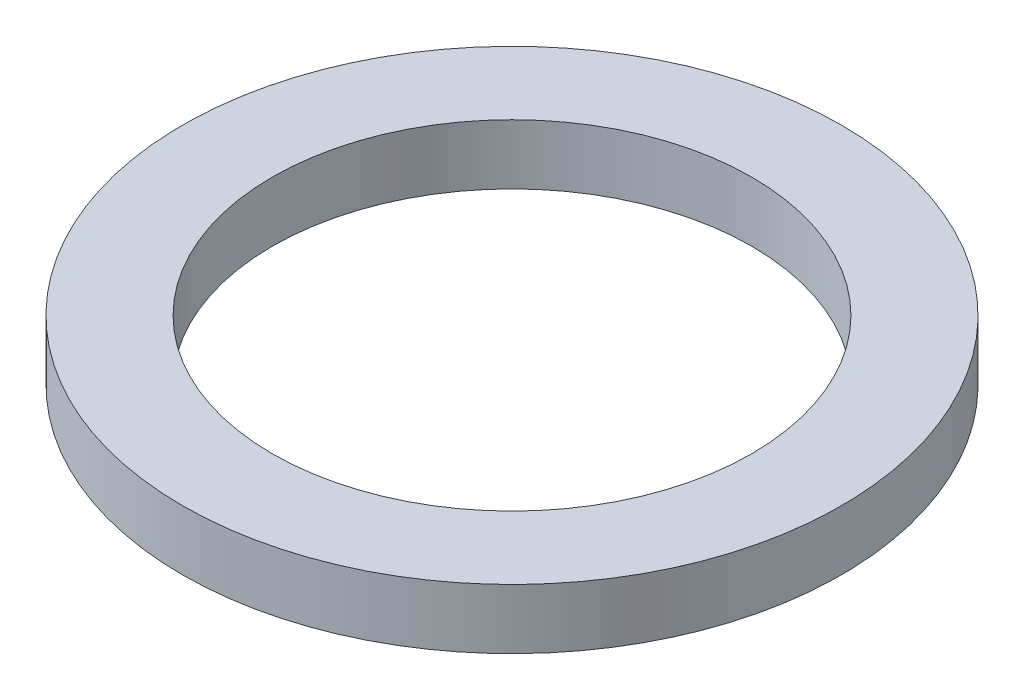
ISO-10303-21;
HEADER;
FILE_DESCRIPTION(('STEP AP214'),'2;1');
FILE_NAME('part.step','',(''),(''),'','','');
FILE_SCHEMA(('AUTOMOTIVE_DESIGN { 1 0 10303 214 1 1 1 1 }'));
ENDSEC;
DATA;
#1=APPLICATION_CONTEXT('core data for automotive mechanical design processes');
#2=APPLICATION_PROTOCOL_DEFINITION('international standard','automotive_design',2000,#1);
#3=PRODUCT_CONTEXT('',#1,'mechanical');
#4=PRODUCT('Part','Part','',(#3));
#5=PRODUCT_RELATED_PRODUCT_CATEGORY('part','',(#4));
#6=PRODUCT_DEFINITION_FORMATION('','',#4);
#7=PRODUCT_DEFINITION_CONTEXT('part definition',#1,'design');
#8=PRODUCT_DEFINITION('design','',#6,#7);
#9=PRODUCT_DEFINITION_SHAPE('','',#8);
#10=(LENGTH_UNIT() NAMED_UNIT(*) SI_UNIT(.MILLI.,.METRE.));
#11=(NAMED_UNIT(*) PLANE_ANGLE_UNIT() SI_UNIT($,.RADIAN.));
#12=(NAMED_UNIT(*) SI_UNIT($,.STERADIAN.) SOLID_ANGLE_UNIT());
#13=UNCERTAINTY_MEASURE_WITH_UNIT(LENGTH_MEASURE(1.E-05),#10,'distance_accuracy_value','');
#14=(GEOMETRIC_REPRESENTATION_CONTEXT(3) GLOBAL_UNCERTAINTY_ASSIGNED_CONTEXT((#13)) GLOBAL_UNIT_ASSIGNED_CONTEXT((#10,
#11,#12)) REPRESENTATION_CONTEXT('',''));
#15=CARTESIAN_POINT('',(0.,0.,0.));
#16=DIRECTION('',(0.,0.,1.));
#17=DIRECTION('',(1.,0.,0.));
#18=AXIS2_PLACEMENT_3D('',#15,#16,#17);
#19=CARTESIAN_POINT('',(0.,0.5,0.));
#20=DIRECTION('',(0.,1.,0.));
#21=DIRECTION('',(0.,0.,1.));
#22=AXIS2_PLACEMENT_3D('',#19,#20,#21);
#23=PLANE('',#22);
#24=CARTESIAN_POINT('',(0.,0.5,0.));
#25=DIRECTION('',(0.,1.,0.));
#26=DIRECTION('',(0.,0.,1.));
#27=AXIS2_PLACEMENT_3D('',#24,#25,#26);
#28=CIRCLE('',#27,5.5);
#29=CARTESIAN_POINT('',(0.,0.5,5.5));
#30=VERTEX_POINT('',#29);
#31=EDGE_CURVE('E10',#30,#30,#28,.T.);
#32=ORIENTED_EDGE('',*,*,#31,.T.);
#33=EDGE_LOOP('',(#32));
#34=FACE_BOUND('',#33,.T.);
#35=CARTESIAN_POINT('',(0.,0.5,0.));
#36=DIRECTION('',(0.,1.,0.));
#37=DIRECTION('',(0.,0.,1.));
#38=AXIS2_PLACEMENT_3D('',#35,#36,#37);
#39=CIRCLE('',#38,4.);
#40=CARTESIAN_POINT('',(0.,0.5,4.));
#41=VERTEX_POINT('',#40);
#42=EDGE_CURVE('E45',#41,#41,#39,.T.);
#43=ORIENTED_EDGE('',*,*,#42,.F.);
#44=EDGE_LOOP('',(#43));
#45=FACE_BOUND('',#44,.T.);
#46=ADVANCED_FACE('F34',(#34,#45),#23,.T.);
#47=CARTESIAN_POINT('',(0.,-0.5,0.));
#48=DIRECTION('',(0.,1.,0.));
#49=DIRECTION('',(0.,0.,1.));
#50=AXIS2_PLACEMENT_3D('',#47,#48,#49);
#51=PLANE('',#50);
#52=CARTESIAN_POINT('',(0.,-0.5,0.));
#53=DIRECTION('',(0.,1.,0.));
#54=DIRECTION('',(0.,0.,1.));
#55=AXIS2_PLACEMENT_3D('',#52,#53,#54);
#56=CIRCLE('',#55,5.5);
#57=CARTESIAN_POINT('',(0.,-0.5,5.5));
#58=VERTEX_POINT('',#57);
#59=EDGE_CURVE('E38',#58,#58,#56,.T.);
#60=ORIENTED_EDGE('',*,*,#59,.F.);
#61=EDGE_LOOP('',(#60));
#62=FACE_BOUND('',#61,.T.);
#63=CARTESIAN_POINT('',(0.,-0.5,0.));
#64=DIRECTION('',(0.,1.,0.));
#65=DIRECTION('',(0.,0.,1.));
#66=AXIS2_PLACEMENT_3D('',#63,#64,#65);
#67=CIRCLE('',#66,4.);
#68=CARTESIAN_POINT('',(0.,-0.5,4.));
#69=VERTEX_POINT('',#68);
#70=EDGE_CURVE('E47',#69,#69,#67,.T.);
#71=ORIENTED_EDGE('',*,*,#70,.T.);
#72=EDGE_LOOP('',(#71));
#73=FACE_BOUND('',#72,.T.);
#74=ADVANCED_FACE('F57',(#62,#73),#51,.F.);
#75=CARTESIAN_POINT('',(0.,0.5,0.));
#76=DIRECTION('',(0.,-1.,0.));
#77=DIRECTION('',(0.,0.,-1.));
#78=AXIS2_PLACEMENT_3D('',#75,#76,#77);
#79=CYLINDRICAL_SURFACE('',#78,5.5);
#80=ORIENTED_EDGE('',*,*,#31,.F.);
#81=EDGE_LOOP('',(#80));
#82=FACE_BOUND('',#81,.T.);
#83=ORIENTED_EDGE('',*,*,#59,.T.);
#84=EDGE_LOOP('',(#83));
#85=FACE_BOUND('',#84,.T.);
#86=ADVANCED_FACE('F36',(#82,#85),#79,.T.);
#87=CARTESIAN_POINT('',(0.,0.5,0.));
#88=DIRECTION('',(0.,-1.,0.));
#89=DIRECTION('',(0.,0.,-1.));
#90=AXIS2_PLACEMENT_3D('',#87,#88,#89);
#91=CYLINDRICAL_SURFACE('',#90,4.);
#92=ORIENTED_EDGE('',*,*,#42,.T.);
#93=EDGE_LOOP('',(#92));
#94=FACE_BOUND('',#93,.T.);
#95=ORIENTED_EDGE('',*,*,#70,.F.);
#96=EDGE_LOOP('',(#95));
#97=FACE_BOUND('',#96,.T.);
#98=ADVANCED_FACE('F53',(#94,#97),#91,.F.);
#99=CLOSED_SHELL('',(#46,#74,#86,#98));
#100=MANIFOLD_SOLID_BREP('B2',#99);
#101=ADVANCED_BREP_SHAPE_REPRESENTATION('',(#18,#100),#14);
#102=SHAPE_DEFINITION_REPRESENTATION(#9,#101);
ENDSEC;
END-ISO-10303-21;
